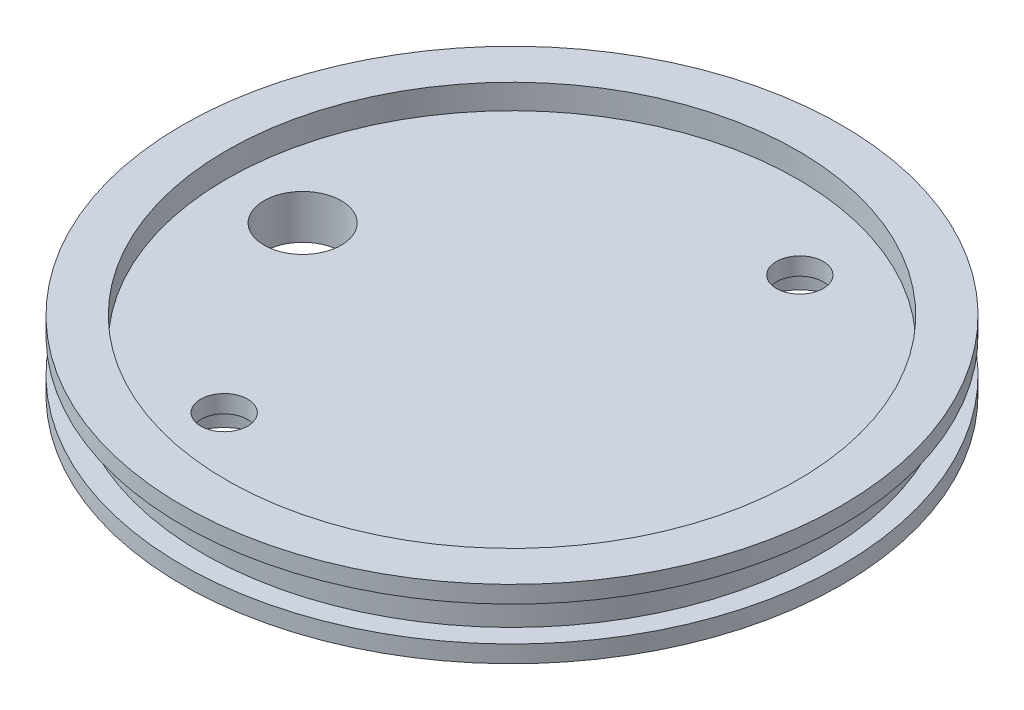
ISO-10303-21;
HEADER;
FILE_DESCRIPTION(('STEP AP214'),'2;1');
FILE_NAME('part.step','',(''),(''),'','','');
FILE_SCHEMA(('AUTOMOTIVE_DESIGN { 1 0 10303 214 1 1 1 1 }'));
ENDSEC;
DATA;
#1=APPLICATION_CONTEXT('core data for automotive mechanical design processes');
#2=APPLICATION_PROTOCOL_DEFINITION('international standard','automotive_design',2000,#1);
#3=PRODUCT_CONTEXT('',#1,'mechanical');
#4=PRODUCT('Part','Part','',(#3));
#5=PRODUCT_RELATED_PRODUCT_CATEGORY('part','',(#4));
#6=PRODUCT_DEFINITION_FORMATION('','',#4);
#7=PRODUCT_DEFINITION_CONTEXT('part definition',#1,'design');
#8=PRODUCT_DEFINITION('design','',#6,#7);
#9=PRODUCT_DEFINITION_SHAPE('','',#8);
#10=(LENGTH_UNIT() NAMED_UNIT(*) SI_UNIT(.MILLI.,.METRE.));
#11=(NAMED_UNIT(*) PLANE_ANGLE_UNIT() SI_UNIT($,.RADIAN.));
#12=(NAMED_UNIT(*) SI_UNIT($,.STERADIAN.) SOLID_ANGLE_UNIT());
#13=UNCERTAINTY_MEASURE_WITH_UNIT(LENGTH_MEASURE(1.E-05),#10,'distance_accuracy_value','');
#14=(GEOMETRIC_REPRESENTATION_CONTEXT(3) GLOBAL_UNCERTAINTY_ASSIGNED_CONTEXT((#13)) GLOBAL_UNIT_ASSIGNED_CONTEXT((#10,
#11,#12)) REPRESENTATION_CONTEXT('',''));
#15=CARTESIAN_POINT('',(0.,0.,0.));
#16=DIRECTION('',(0.,0.,1.));
#17=DIRECTION('',(1.,0.,0.));
#18=AXIS2_PLACEMENT_3D('',#15,#16,#17);
#19=CARTESIAN_POINT('',(0.,0.,0.));
#20=DIRECTION('',(0.,1.,0.));
#21=DIRECTION('',(-1.,0.,0.));
#22=AXIS2_PLACEMENT_3D('',#19,#20,#21);
#23=PLANE('',#22);
#24=CARTESIAN_POINT('',(12.1501989775917,0.,-29.3331751572333));
#25=DIRECTION('',(0.,-1.,0.));
#26=DIRECTION('',(0.,0.,-1.));
#27=AXIS2_PLACEMENT_3D('',#24,#25,#26);
#28=CIRCLE('',#27,6.35);
#29=CARTESIAN_POINT('',(12.1501989775917,0.,-35.6831751572333));
#30=VERTEX_POINT('',#29);
#31=EDGE_CURVE('E164',#30,#30,#28,.T.);
#32=ORIENTED_EDGE('',*,*,#31,.F.);
#33=EDGE_LOOP('',(#32));
#34=FACE_BOUND('',#33,.T.);
#35=CARTESIAN_POINT('',(-12.1501989775917,0.,29.3331751572333));
#36=DIRECTION('',(0.,-1.,0.));
#37=DIRECTION('',(0.,0.,-1.));
#38=AXIS2_PLACEMENT_3D('',#35,#36,#37);
#39=CIRCLE('',#38,6.35);
#40=CARTESIAN_POINT('',(-12.1501989775917,0.,22.9831751572333));
#41=VERTEX_POINT('',#40);
#42=EDGE_CURVE('E69',#41,#41,#39,.T.);
#43=ORIENTED_EDGE('',*,*,#42,.F.);
#44=EDGE_LOOP('',(#43));
#45=FACE_BOUND('',#44,.T.);
#46=CARTESIAN_POINT('',(-30.1752,0.,0.));
#47=DIRECTION('',(0.,1.,0.));
#48=DIRECTION('',(0.,0.,1.));
#49=AXIS2_PLACEMENT_3D('',#46,#47,#48);
#50=CIRCLE('',#49,5.5626);
#51=CARTESIAN_POINT('',(-30.1752,0.,5.5626));
#52=VERTEX_POINT('',#51);
#53=EDGE_CURVE('E61',#52,#52,#50,.T.);
#54=ORIENTED_EDGE('',*,*,#53,.T.);
#55=EDGE_LOOP('',(#54));
#56=FACE_BOUND('',#55,.T.);
#57=CARTESIAN_POINT('',(0.,0.,0.));
#58=DIRECTION('',(0.,1.,0.));
#59=DIRECTION('',(-1.,0.,0.));
#60=AXIS2_PLACEMENT_3D('',#57,#58,#59);
#61=CIRCLE('',#60,47.498);
#62=CARTESIAN_POINT('',(-47.498,0.,0.));
#63=VERTEX_POINT('',#62);
#64=EDGE_CURVE('E10',#63,#63,#61,.T.);
#65=ORIENTED_EDGE('',*,*,#64,.F.);
#66=EDGE_LOOP('',(#65));
#67=FACE_BOUND('',#66,.T.);
#68=ADVANCED_FACE('F39',(#34,#45,#56,#67),#23,.F.);
#69=CARTESIAN_POINT('',(0.,48.1922132313012,0.));
#70=DIRECTION('',(0.,1.,0.));
#71=DIRECTION('',(-1.,0.,0.));
#72=AXIS2_PLACEMENT_3D('',#69,#70,#71);
#73=CYLINDRICAL_SURFACE('',#72,47.498);
#74=CARTESIAN_POINT('',(0.,2.46379999999999,0.));
#75=DIRECTION('',(0.,1.,0.));
#76=DIRECTION('',(-1.,0.,0.));
#77=AXIS2_PLACEMENT_3D('',#74,#75,#76);
#78=CIRCLE('',#77,47.498);
#79=CARTESIAN_POINT('',(-47.498,2.46379999999998,0.));
#80=VERTEX_POINT('',#79);
#81=EDGE_CURVE('E46',#80,#80,#78,.T.);
#82=ORIENTED_EDGE('',*,*,#81,.F.);
#83=EDGE_LOOP('',(#82));
#84=FACE_BOUND('',#83,.T.);
#85=ORIENTED_EDGE('',*,*,#64,.T.);
#86=EDGE_LOOP('',(#85));
#87=FACE_BOUND('',#86,.T.);
#88=ADVANCED_FACE('F97',(#84,#87),#73,.T.);
#89=CARTESIAN_POINT('',(47.498,2.4638,0.));
#90=DIRECTION('',(0.,-1.,0.));
#91=DIRECTION('',(1.,0.,0.));
#92=AXIS2_PLACEMENT_3D('',#89,#90,#91);
#93=PLANE('',#92);
#94=CARTESIAN_POINT('',(0.,2.46379999999999,0.));
#95=DIRECTION('',(0.,1.,0.));
#96=DIRECTION('',(-1.,0.,0.));
#97=AXIS2_PLACEMENT_3D('',#94,#95,#96);
#98=CIRCLE('',#97,44.577);
#99=CARTESIAN_POINT('',(-44.577,2.46379999999998,0.));
#100=VERTEX_POINT('',#99);
#101=EDGE_CURVE('E51',#100,#100,#98,.T.);
#102=ORIENTED_EDGE('',*,*,#101,.F.);
#103=EDGE_LOOP('',(#102));
#104=FACE_BOUND('',#103,.T.);
#105=ORIENTED_EDGE('',*,*,#81,.T.);
#106=EDGE_LOOP('',(#105));
#107=FACE_BOUND('',#106,.T.);
#108=ADVANCED_FACE('F94',(#104,#107),#93,.F.);
#109=CARTESIAN_POINT('',(0.,48.1922132313012,0.));
#110=DIRECTION('',(0.,1.,0.));
#111=DIRECTION('',(-1.,0.,0.));
#112=AXIS2_PLACEMENT_3D('',#109,#110,#111);
#113=CYLINDRICAL_SURFACE('',#112,44.577);
#114=CARTESIAN_POINT('',(0.,7.44219999999999,0.));
#115=DIRECTION('',(0.,1.,0.));
#116=DIRECTION('',(-1.,0.,0.));
#117=AXIS2_PLACEMENT_3D('',#114,#115,#116);
#118=CIRCLE('',#117,44.577);
#119=CARTESIAN_POINT('',(-44.577,7.44219999999998,0.));
#120=VERTEX_POINT('',#119);
#121=EDGE_CURVE('E87',#120,#120,#118,.T.);
#122=ORIENTED_EDGE('',*,*,#121,.F.);
#123=EDGE_LOOP('',(#122));
#124=FACE_BOUND('',#123,.T.);
#125=ORIENTED_EDGE('',*,*,#101,.T.);
#126=EDGE_LOOP('',(#125));
#127=FACE_BOUND('',#126,.T.);
#128=ADVANCED_FACE('F92',(#124,#127),#113,.T.);
#129=CARTESIAN_POINT('',(44.577,7.4422,0.));
#130=DIRECTION('',(0.,1.,0.));
#131=DIRECTION('',(-1.,0.,0.));
#132=AXIS2_PLACEMENT_3D('',#129,#130,#131);
#133=PLANE('',#132);
#134=CARTESIAN_POINT('',(0.,7.44219999999999,0.));
#135=DIRECTION('',(0.,1.,0.));
#136=DIRECTION('',(-1.,0.,0.));
#137=AXIS2_PLACEMENT_3D('',#134,#135,#136);
#138=CIRCLE('',#137,47.498);
#139=CARTESIAN_POINT('',(-47.498,7.44219999999998,0.));
#140=VERTEX_POINT('',#139);
#141=EDGE_CURVE('E84',#140,#140,#138,.T.);
#142=ORIENTED_EDGE('',*,*,#141,.F.);
#143=EDGE_LOOP('',(#142));
#144=FACE_BOUND('',#143,.T.);
#145=ORIENTED_EDGE('',*,*,#121,.T.);
#146=EDGE_LOOP('',(#145));
#147=FACE_BOUND('',#146,.T.);
#148=ADVANCED_FACE('F109',(#144,#147),#133,.F.);
#149=CARTESIAN_POINT('',(0.,48.1922132313012,0.));
#150=DIRECTION('',(0.,1.,0.));
#151=DIRECTION('',(-1.,0.,0.));
#152=AXIS2_PLACEMENT_3D('',#149,#150,#151);
#153=CYLINDRICAL_SURFACE('',#152,47.498);
#154=CARTESIAN_POINT('',(0.,9.90599999999999,0.));
#155=DIRECTION('',(0.,1.,0.));
#156=DIRECTION('',(-1.,0.,0.));
#157=AXIS2_PLACEMENT_3D('',#154,#155,#156);
#158=CIRCLE('',#157,47.498);
#159=CARTESIAN_POINT('',(-47.498,9.90599999999999,0.));
#160=VERTEX_POINT('',#159);
#161=EDGE_CURVE('E81',#160,#160,#158,.T.);
#162=ORIENTED_EDGE('',*,*,#161,.F.);
#163=EDGE_LOOP('',(#162));
#164=FACE_BOUND('',#163,.T.);
#165=ORIENTED_EDGE('',*,*,#141,.T.);
#166=EDGE_LOOP('',(#165));
#167=FACE_BOUND('',#166,.T.);
#168=ADVANCED_FACE('F113',(#164,#167),#153,.T.);
#169=CARTESIAN_POINT('',(47.498,9.906,0.));
#170=DIRECTION('',(0.,-1.,0.));
#171=DIRECTION('',(1.,0.,0.));
#172=AXIS2_PLACEMENT_3D('',#169,#170,#171);
#173=PLANE('',#172);
#174=CARTESIAN_POINT('',(0.,9.90599999999999,0.));
#175=DIRECTION('',(0.,1.,0.));
#176=DIRECTION('',(-1.,0.,0.));
#177=AXIS2_PLACEMENT_3D('',#174,#175,#176);
#178=CIRCLE('',#177,41.148);
#179=CARTESIAN_POINT('',(-41.148,9.90599999999999,0.));
#180=VERTEX_POINT('',#179);
#181=EDGE_CURVE('E78',#180,#180,#178,.T.);
#182=ORIENTED_EDGE('',*,*,#181,.F.);
#183=EDGE_LOOP('',(#182));
#184=FACE_BOUND('',#183,.T.);
#185=ORIENTED_EDGE('',*,*,#161,.T.);
#186=EDGE_LOOP('',(#185));
#187=FACE_BOUND('',#186,.T.);
#188=ADVANCED_FACE('F117',(#184,#187),#173,.F.);
#189=CARTESIAN_POINT('',(0.,48.1922132313012,0.));
#190=DIRECTION('',(0.,1.,0.));
#191=DIRECTION('',(-1.,0.,0.));
#192=AXIS2_PLACEMENT_3D('',#189,#190,#191);
#193=CYLINDRICAL_SURFACE('',#192,41.148);
#194=CARTESIAN_POINT('',(0.,6.34999999999999,0.));
#195=DIRECTION('',(0.,1.,0.));
#196=DIRECTION('',(-1.,0.,0.));
#197=AXIS2_PLACEMENT_3D('',#194,#195,#196);
#198=CIRCLE('',#197,41.148);
#199=CARTESIAN_POINT('',(-41.148,6.34999999999999,0.));
#200=VERTEX_POINT('',#199);
#201=EDGE_CURVE('E75',#200,#200,#198,.T.);
#202=ORIENTED_EDGE('',*,*,#201,.F.);
#203=EDGE_LOOP('',(#202));
#204=FACE_BOUND('',#203,.T.);
#205=ORIENTED_EDGE('',*,*,#181,.T.);
#206=EDGE_LOOP('',(#205));
#207=FACE_BOUND('',#206,.T.);
#208=ADVANCED_FACE('F121',(#204,#207),#193,.F.);
#209=CARTESIAN_POINT('',(41.148,6.35,0.));
#210=DIRECTION('',(0.,-1.,0.));
#211=DIRECTION('',(1.,0.,0.));
#212=AXIS2_PLACEMENT_3D('',#209,#210,#211);
#213=PLANE('',#212);
#214=CARTESIAN_POINT('',(12.1501989775917,6.35,-29.3331751572333));
#215=DIRECTION('',(0.,-1.,0.));
#216=DIRECTION('',(1.,0.,0.));
#217=AXIS2_PLACEMENT_3D('',#214,#215,#216);
#218=CIRCLE('',#217,3.3782);
#219=CARTESIAN_POINT('',(15.5283989775917,6.35,-29.3331751572333));
#220=VERTEX_POINT('',#219);
#221=EDGE_CURVE('E42',#220,#220,#218,.T.);
#222=ORIENTED_EDGE('',*,*,#221,.T.);
#223=EDGE_LOOP('',(#222));
#224=FACE_BOUND('',#223,.T.);
#225=CARTESIAN_POINT('',(-12.1501989775917,6.34999999999999,29.3331751572333));
#226=DIRECTION('',(0.,-1.,0.));
#227=DIRECTION('',(1.,0.,0.));
#228=AXIS2_PLACEMENT_3D('',#225,#226,#227);
#229=CIRCLE('',#228,3.3782);
#230=CARTESIAN_POINT('',(-8.77199897759172,6.34999999999999,29.3331751572333));
#231=VERTEX_POINT('',#230);
#232=EDGE_CURVE('E54',#231,#231,#229,.T.);
#233=ORIENTED_EDGE('',*,*,#232,.T.);
#234=EDGE_LOOP('',(#233));
#235=FACE_BOUND('',#234,.T.);
#236=CARTESIAN_POINT('',(-30.1752,6.34999999999999,0.));
#237=DIRECTION('',(0.,1.,0.));
#238=DIRECTION('',(0.,0.,1.));
#239=AXIS2_PLACEMENT_3D('',#236,#237,#238);
#240=CIRCLE('',#239,5.56259999999999);
#241=CARTESIAN_POINT('',(-30.1752,6.34999999999999,5.56259999999999));
#242=VERTEX_POINT('',#241);
#243=EDGE_CURVE('E56',#242,#242,#240,.T.);
#244=ORIENTED_EDGE('',*,*,#243,.F.);
#245=EDGE_LOOP('',(#244));
#246=FACE_BOUND('',#245,.T.);
#247=ORIENTED_EDGE('',*,*,#201,.T.);
#248=EDGE_LOOP('',(#247));
#249=FACE_BOUND('',#248,.T.);
#250=ADVANCED_FACE('F125',(#224,#235,#246,#249),#213,.F.);
#251=CARTESIAN_POINT('',(-30.1752,6.34999999999999,0.));
#252=DIRECTION('',(0.,1.,0.));
#253=DIRECTION('',(0.,0.,1.));
#254=AXIS2_PLACEMENT_3D('',#251,#252,#253);
#255=CYLINDRICAL_SURFACE('',#254,5.56259999999999);
#256=ORIENTED_EDGE('',*,*,#53,.F.);
#257=EDGE_LOOP('',(#256));
#258=FACE_BOUND('',#257,.T.);
#259=ORIENTED_EDGE('',*,*,#243,.T.);
#260=EDGE_LOOP('',(#259));
#261=FACE_BOUND('',#260,.T.);
#262=ADVANCED_FACE('F129',(#258,#261),#255,.F.);
#263=CARTESIAN_POINT('',(-12.1501989775917,0.,29.3331751572333));
#264=DIRECTION('',(0.,-1.,0.));
#265=DIRECTION('',(0.,0.,-1.));
#266=AXIS2_PLACEMENT_3D('',#263,#264,#265);
#267=CYLINDRICAL_SURFACE('',#266,3.3782);
#268=CARTESIAN_POINT('',(-12.1501989775917,3.81,29.3331751572333));
#269=DIRECTION('',(0.,-1.,0.));
#270=DIRECTION('',(0.,0.,-1.));
#271=AXIS2_PLACEMENT_3D('',#268,#269,#270);
#272=CIRCLE('',#271,3.3782);
#273=CARTESIAN_POINT('',(-12.1501989775917,3.81,25.9549751572333));
#274=VERTEX_POINT('',#273);
#275=EDGE_CURVE('E57',#274,#274,#272,.T.);
#276=ORIENTED_EDGE('',*,*,#275,.T.);
#277=EDGE_LOOP('',(#276));
#278=FACE_BOUND('',#277,.T.);
#279=ORIENTED_EDGE('',*,*,#232,.F.);
#280=EDGE_LOOP('',(#279));
#281=FACE_BOUND('',#280,.T.);
#282=ADVANCED_FACE('F133',(#278,#281),#267,.F.);
#283=CARTESIAN_POINT('',(-8.77199897759172,3.81,29.3331751572333));
#284=DIRECTION('',(0.,1.,0.));
#285=DIRECTION('',(0.,0.,1.));
#286=AXIS2_PLACEMENT_3D('',#283,#284,#285);
#287=PLANE('',#286);
#288=ORIENTED_EDGE('',*,*,#275,.F.);
#289=EDGE_LOOP('',(#288));
#290=FACE_BOUND('',#289,.T.);
#291=CARTESIAN_POINT('',(-12.1501989775917,3.81,29.3331751572333));
#292=DIRECTION('',(0.,-1.,0.));
#293=DIRECTION('',(0.,0.,-1.));
#294=AXIS2_PLACEMENT_3D('',#291,#292,#293);
#295=CIRCLE('',#294,6.35);
#296=CARTESIAN_POINT('',(-12.1501989775917,3.81,22.9831751572333));
#297=VERTEX_POINT('',#296);
#298=EDGE_CURVE('E64',#297,#297,#295,.T.);
#299=ORIENTED_EDGE('',*,*,#298,.T.);
#300=EDGE_LOOP('',(#299));
#301=FACE_BOUND('',#300,.T.);
#302=ADVANCED_FACE('F137',(#290,#301),#287,.F.);
#303=CARTESIAN_POINT('',(-12.1501989775917,0.,29.3331751572333));
#304=DIRECTION('',(0.,-1.,0.));
#305=DIRECTION('',(0.,0.,-1.));
#306=AXIS2_PLACEMENT_3D('',#303,#304,#305);
#307=CYLINDRICAL_SURFACE('',#306,6.35);
#308=ORIENTED_EDGE('',*,*,#298,.F.);
#309=EDGE_LOOP('',(#308));
#310=FACE_BOUND('',#309,.T.);
#311=ORIENTED_EDGE('',*,*,#42,.T.);
#312=EDGE_LOOP('',(#311));
#313=FACE_BOUND('',#312,.T.);
#314=ADVANCED_FACE('F140',(#310,#313),#307,.F.);
#315=CARTESIAN_POINT('',(12.1501989775917,0.,-29.3331751572333));
#316=DIRECTION('',(0.,-1.,0.));
#317=DIRECTION('',(0.,0.,-1.));
#318=AXIS2_PLACEMENT_3D('',#315,#316,#317);
#319=CYLINDRICAL_SURFACE('',#318,3.3782);
#320=CARTESIAN_POINT('',(12.1501989775917,3.81,-29.3331751572333));
#321=DIRECTION('',(0.,-1.,0.));
#322=DIRECTION('',(0.,0.,-1.));
#323=AXIS2_PLACEMENT_3D('',#320,#321,#322);
#324=CIRCLE('',#323,3.3782);
#325=CARTESIAN_POINT('',(12.1501989775917,3.81,-32.7113751572333));
#326=VERTEX_POINT('',#325);
#327=EDGE_CURVE('E166',#326,#326,#324,.T.);
#328=ORIENTED_EDGE('',*,*,#327,.T.);
#329=EDGE_LOOP('',(#328));
#330=FACE_BOUND('',#329,.T.);
#331=ORIENTED_EDGE('',*,*,#221,.F.);
#332=EDGE_LOOP('',(#331));
#333=FACE_BOUND('',#332,.T.);
#334=ADVANCED_FACE('F144',(#330,#333),#319,.F.);
#335=CARTESIAN_POINT('',(15.5283989775917,3.81,-29.3331751572333));
#336=DIRECTION('',(0.,1.,0.));
#337=DIRECTION('',(0.,0.,1.));
#338=AXIS2_PLACEMENT_3D('',#335,#336,#337);
#339=PLANE('',#338);
#340=ORIENTED_EDGE('',*,*,#327,.F.);
#341=EDGE_LOOP('',(#340));
#342=FACE_BOUND('',#341,.T.);
#343=CARTESIAN_POINT('',(12.1501989775917,3.81,-29.3331751572333));
#344=DIRECTION('',(0.,-1.,0.));
#345=DIRECTION('',(0.,0.,-1.));
#346=AXIS2_PLACEMENT_3D('',#343,#344,#345);
#347=CIRCLE('',#346,6.35);
#348=CARTESIAN_POINT('',(12.1501989775917,3.81,-35.6831751572333));
#349=VERTEX_POINT('',#348);
#350=EDGE_CURVE('E161',#349,#349,#347,.T.);
#351=ORIENTED_EDGE('',*,*,#350,.T.);
#352=EDGE_LOOP('',(#351));
#353=FACE_BOUND('',#352,.T.);
#354=ADVANCED_FACE('F148',(#342,#353),#339,.F.);
#355=CARTESIAN_POINT('',(12.1501989775917,0.,-29.3331751572333));
#356=DIRECTION('',(0.,-1.,0.));
#357=DIRECTION('',(0.,0.,-1.));
#358=AXIS2_PLACEMENT_3D('',#355,#356,#357);
#359=CYLINDRICAL_SURFACE('',#358,6.35);
#360=ORIENTED_EDGE('',*,*,#350,.F.);
#361=EDGE_LOOP('',(#360));
#362=FACE_BOUND('',#361,.T.);
#363=ORIENTED_EDGE('',*,*,#31,.T.);
#364=EDGE_LOOP('',(#363));
#365=FACE_BOUND('',#364,.T.);
#366=ADVANCED_FACE('F152',(#362,#365),#359,.F.);
#367=CLOSED_SHELL('',(#68,#88,#108,#128,#148,#168,#188,#208,#250,#262,#282,#302,#314,#334,#354,#366));
#368=MANIFOLD_SOLID_BREP('B2',#367);
#369=ADVANCED_BREP_SHAPE_REPRESENTATION('',(#18,#368),#14);
#370=SHAPE_DEFINITION_REPRESENTATION(#9,#369);
ENDSEC;
END-ISO-10303-21;
